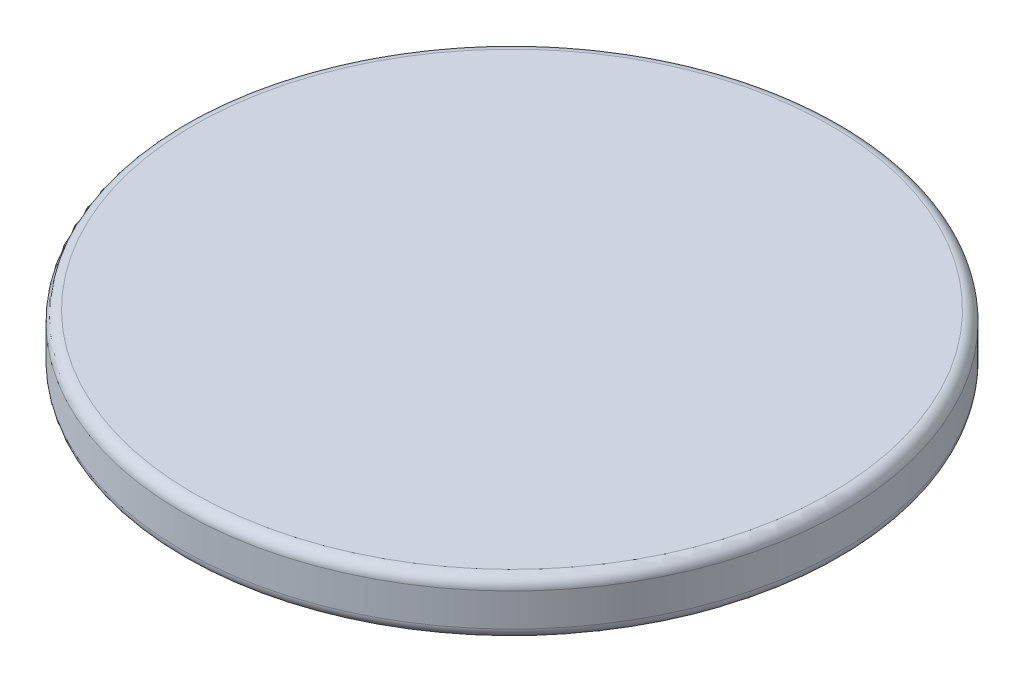
ISO-10303-21;
HEADER;
FILE_DESCRIPTION(('STEP AP214'),'2;1');
FILE_NAME('part.step','',(''),(''),'','','');
FILE_SCHEMA(('AUTOMOTIVE_DESIGN { 1 0 10303 214 1 1 1 1 }'));
ENDSEC;
DATA;
#1=APPLICATION_CONTEXT('core data for automotive mechanical design processes');
#2=APPLICATION_PROTOCOL_DEFINITION('international standard','automotive_design',2000,#1);
#3=PRODUCT_CONTEXT('',#1,'mechanical');
#4=PRODUCT('Part','Part','',(#3));
#5=PRODUCT_RELATED_PRODUCT_CATEGORY('part','',(#4));
#6=PRODUCT_DEFINITION_FORMATION('','',#4);
#7=PRODUCT_DEFINITION_CONTEXT('part definition',#1,'design');
#8=PRODUCT_DEFINITION('design','',#6,#7);
#9=PRODUCT_DEFINITION_SHAPE('','',#8);
#10=(LENGTH_UNIT() NAMED_UNIT(*) SI_UNIT(.MILLI.,.METRE.));
#11=(NAMED_UNIT(*) PLANE_ANGLE_UNIT() SI_UNIT($,.RADIAN.));
#12=(NAMED_UNIT(*) SI_UNIT($,.STERADIAN.) SOLID_ANGLE_UNIT());
#13=UNCERTAINTY_MEASURE_WITH_UNIT(LENGTH_MEASURE(1.E-05),#10,'distance_accuracy_value','');
#14=(GEOMETRIC_REPRESENTATION_CONTEXT(3) GLOBAL_UNCERTAINTY_ASSIGNED_CONTEXT((#13)) GLOBAL_UNIT_ASSIGNED_CONTEXT((#10,
#11,#12)) REPRESENTATION_CONTEXT('',''));
#15=CARTESIAN_POINT('',(0.,0.,0.));
#16=DIRECTION('',(0.,0.,1.));
#17=DIRECTION('',(1.,0.,0.));
#18=AXIS2_PLACEMENT_3D('',#15,#16,#17);
#19=CARTESIAN_POINT('',(0.,38.1,0.));
#20=DIRECTION('',(0.,-1.,0.));
#21=DIRECTION('',(0.,0.,-1.));
#22=AXIS2_PLACEMENT_3D('',#19,#20,#21);
#23=CYLINDRICAL_SURFACE('',#22,228.6);
#24=CARTESIAN_POINT('',(0.,7.62,0.));
#25=DIRECTION('',(0.,1.,0.));
#26=DIRECTION('',(0.,0.,1.));
#27=AXIS2_PLACEMENT_3D('',#24,#25,#26);
#28=CIRCLE('',#27,228.6);
#29=CARTESIAN_POINT('',(0.,7.62,-228.6));
#30=VERTEX_POINT('',#29);
#31=EDGE_CURVE('E48',#30,#30,#28,.T.);
#32=CARTESIAN_POINT('',(0.,30.48,0.));
#33=DIRECTION('',(0.,1.,0.));
#34=DIRECTION('',(0.,0.,1.));
#35=AXIS2_PLACEMENT_3D('',#32,#33,#34);
#36=CIRCLE('',#35,228.6);
#37=CARTESIAN_POINT('',(0.,30.48,-228.6));
#38=VERTEX_POINT('',#37);
#39=EDGE_CURVE('E53',#38,#38,#36,.F.);
#40=CARTESIAN_POINT('',(0.,7.62,-228.6));
#41=CARTESIAN_POINT('',(0.,7.858125,-228.6));
#42=CARTESIAN_POINT('',(0.,8.09625,-228.6));
#43=CARTESIAN_POINT('',(0.,8.5725,-228.6));
#44=CARTESIAN_POINT('',(0.,8.810625,-228.6));
#45=CARTESIAN_POINT('',(0.,9.286875,-228.6));
#46=CARTESIAN_POINT('',(0.,9.525,-228.6));
#47=CARTESIAN_POINT('',(0.,10.00125,-228.6));
#48=CARTESIAN_POINT('',(0.,10.239375,-228.6));
#49=CARTESIAN_POINT('',(0.,10.715625,-228.6));
#50=CARTESIAN_POINT('',(0.,10.95375,-228.6));
#51=CARTESIAN_POINT('',(0.,11.43,-228.6));
#52=CARTESIAN_POINT('',(0.,11.668125,-228.6));
#53=CARTESIAN_POINT('',(0.,12.144375,-228.6));
#54=CARTESIAN_POINT('',(0.,12.3825,-228.6));
#55=CARTESIAN_POINT('',(0.,12.85875,-228.6));
#56=CARTESIAN_POINT('',(0.,13.096875,-228.6));
#57=CARTESIAN_POINT('',(0.,13.573125,-228.6));
#58=CARTESIAN_POINT('',(0.,13.81125,-228.6));
#59=CARTESIAN_POINT('',(0.,14.2875,-228.6));
#60=CARTESIAN_POINT('',(0.,14.525625,-228.6));
#61=CARTESIAN_POINT('',(0.,15.001875,-228.6));
#62=CARTESIAN_POINT('',(0.,15.24,-228.6));
#63=CARTESIAN_POINT('',(0.,15.71625,-228.6));
#64=CARTESIAN_POINT('',(0.,15.954375,-228.6));
#65=CARTESIAN_POINT('',(0.,16.430625,-228.6));
#66=CARTESIAN_POINT('',(0.,16.66875,-228.6));
#67=CARTESIAN_POINT('',(0.,17.145,-228.6));
#68=CARTESIAN_POINT('',(0.,17.383125,-228.6));
#69=CARTESIAN_POINT('',(0.,17.859375,-228.6));
#70=CARTESIAN_POINT('',(0.,18.0975,-228.6));
#71=CARTESIAN_POINT('',(0.,18.57375,-228.6));
#72=CARTESIAN_POINT('',(0.,18.811875,-228.6));
#73=CARTESIAN_POINT('',(0.,19.288125,-228.6));
#74=CARTESIAN_POINT('',(0.,19.52625,-228.6));
#75=CARTESIAN_POINT('',(0.,20.0025,-228.6));
#76=CARTESIAN_POINT('',(0.,20.240625,-228.6));
#77=CARTESIAN_POINT('',(0.,20.716875,-228.6));
#78=CARTESIAN_POINT('',(0.,20.955,-228.6));
#79=CARTESIAN_POINT('',(0.,21.43125,-228.6));
#80=CARTESIAN_POINT('',(0.,21.669375,-228.6));
#81=CARTESIAN_POINT('',(0.,22.145625,-228.6));
#82=CARTESIAN_POINT('',(0.,22.38375,-228.6));
#83=CARTESIAN_POINT('',(0.,22.86,-228.6));
#84=CARTESIAN_POINT('',(0.,23.098125,-228.6));
#85=CARTESIAN_POINT('',(0.,23.574375,-228.6));
#86=CARTESIAN_POINT('',(0.,23.8125,-228.6));
#87=CARTESIAN_POINT('',(0.,24.28875,-228.6));
#88=CARTESIAN_POINT('',(0.,24.526875,-228.6));
#89=CARTESIAN_POINT('',(0.,25.003125,-228.6));
#90=CARTESIAN_POINT('',(0.,25.24125,-228.6));
#91=CARTESIAN_POINT('',(0.,25.7175,-228.6));
#92=CARTESIAN_POINT('',(0.,25.955625,-228.6));
#93=CARTESIAN_POINT('',(0.,26.431875,-228.6));
#94=CARTESIAN_POINT('',(0.,26.67,-228.6));
#95=CARTESIAN_POINT('',(0.,27.14625,-228.6));
#96=CARTESIAN_POINT('',(0.,27.384375,-228.6));
#97=CARTESIAN_POINT('',(0.,27.860625,-228.6));
#98=CARTESIAN_POINT('',(0.,28.09875,-228.6));
#99=CARTESIAN_POINT('',(0.,28.575,-228.6));
#100=CARTESIAN_POINT('',(0.,28.813125,-228.6));
#101=CARTESIAN_POINT('',(0.,29.289375,-228.6));
#102=CARTESIAN_POINT('',(0.,29.5275,-228.6));
#103=CARTESIAN_POINT('',(0.,30.00375,-228.6));
#104=CARTESIAN_POINT('',(0.,30.241875,-228.6));
#105=CARTESIAN_POINT('',(0.,30.48,-228.6));
#106=B_SPLINE_CURVE_WITH_KNOTS('',3,(#40,#41,#42,#43,#44,#45,#46,#47,#48,#49,#50,#51,#52,#53,
#54,#55,#56,#57,#58,#59,#60,#61,#62,#63,#64,#65,#66,#67,#68,#69,#70,#71,#72,#73,#74,#75,#76,#77,
#78,#79,#80,#81,#82,#83,#84,#85,#86,#87,#88,#89,#90,#91,#92,#93,#94,#95,#96,#97,#98,#99,#100,
#101,#102,#103,#104,#105),.UNSPECIFIED.,.F.,.F.,(4,2,2,2,2,2,2,2,2,2,2,2,2,2,2,2,2,2,2,2,2,2,2,
2,2,2,2,2,2,2,2,2,4),(0.,0.714375,1.42875,2.143125,2.8575,3.571875,4.28625,5.000625,5.715,
6.429375,7.14375,7.858125,8.5725,9.286875,10.00125,10.715625,11.43,12.144375,12.85875,13.573125,
14.2875,15.001875,15.71625,16.430625,17.145,17.859375,18.57375,19.288125,20.0025,20.716875,
21.43125,22.145625,22.86),.UNSPECIFIED.);
#107=EDGE_CURVE('BSEAM34',#30,#38,#106,.T.);
#108=ORIENTED_EDGE('',*,*,#31,.T.);
#109=ORIENTED_EDGE('',*,*,#39,.T.);
#110=ORIENTED_EDGE('',*,*,#107,.T.);
#111=ORIENTED_EDGE('',*,*,#107,.F.);
#112=EDGE_LOOP('',(#108,#110,#109,#111));
#113=FACE_BOUND('',#112,.T.);
#114=ADVANCED_FACE('F34',(#113),#23,.T.);
#115=CARTESIAN_POINT('',(0.,38.1,0.));
#116=DIRECTION('',(0.,1.,0.));
#117=DIRECTION('',(0.,0.,1.));
#118=AXIS2_PLACEMENT_3D('',#115,#116,#117);
#119=PLANE('',#118);
#120=CARTESIAN_POINT('',(0.,38.1,0.));
#121=DIRECTION('',(0.,1.,0.));
#122=DIRECTION('',(0.,0.,1.));
#123=AXIS2_PLACEMENT_3D('',#120,#121,#122);
#124=CIRCLE('',#123,220.98);
#125=CARTESIAN_POINT('',(0.,38.1,220.98));
#126=VERTEX_POINT('',#125);
#127=EDGE_CURVE('E10',#126,#126,#124,.T.);
#128=ORIENTED_EDGE('',*,*,#127,.T.);
#129=EDGE_LOOP('',(#128));
#130=FACE_BOUND('',#129,.T.);
#131=ADVANCED_FACE('F69',(#130),#119,.T.);
#132=CARTESIAN_POINT('',(0.,0.,0.));
#133=DIRECTION('',(0.,1.,0.));
#134=DIRECTION('',(0.,0.,1.));
#135=AXIS2_PLACEMENT_3D('',#132,#133,#134);
#136=PLANE('',#135);
#137=CARTESIAN_POINT('',(0.,0.,0.));
#138=DIRECTION('',(0.,1.,0.));
#139=DIRECTION('',(0.,0.,1.));
#140=AXIS2_PLACEMENT_3D('',#137,#138,#139);
#141=CIRCLE('',#140,220.98);
#142=CARTESIAN_POINT('',(0.,0.,220.98));
#143=VERTEX_POINT('',#142);
#144=EDGE_CURVE('E42',#143,#143,#141,.F.);
#145=ORIENTED_EDGE('',*,*,#144,.T.);
#146=EDGE_LOOP('',(#145));
#147=FACE_BOUND('',#146,.T.);
#148=ADVANCED_FACE('F66',(#147),#136,.F.);
#149=CARTESIAN_POINT('',(0.,7.62,0.));
#150=DIRECTION('',(0.,1.,0.));
#151=DIRECTION('',(0.,0.,1.));
#152=AXIS2_PLACEMENT_3D('',#149,#150,#151);
#153=TOROIDAL_SURFACE('',#152,220.98,7.62);
#154=ORIENTED_EDGE('',*,*,#144,.F.);
#155=EDGE_LOOP('',(#154));
#156=FACE_BOUND('',#155,.T.);
#157=ORIENTED_EDGE('',*,*,#31,.F.);
#158=EDGE_LOOP('',(#157));
#159=FACE_BOUND('',#158,.T.);
#160=ADVANCED_FACE('F62',(#156,#159),#153,.T.);
#161=CARTESIAN_POINT('',(0.,30.48,0.));
#162=DIRECTION('',(0.,1.,0.));
#163=DIRECTION('',(0.,0.,1.));
#164=AXIS2_PLACEMENT_3D('',#161,#162,#163);
#165=TOROIDAL_SURFACE('',#164,220.98,7.62);
#166=ORIENTED_EDGE('',*,*,#39,.F.);
#167=EDGE_LOOP('',(#166));
#168=FACE_BOUND('',#167,.T.);
#169=ORIENTED_EDGE('',*,*,#127,.F.);
#170=EDGE_LOOP('',(#169));
#171=FACE_BOUND('',#170,.T.);
#172=ADVANCED_FACE('F36',(#168,#171),#165,.T.);
#173=CLOSED_SHELL('',(#114,#131,#148,#160,#172));
#174=MANIFOLD_SOLID_BREP('B2',#173);
#175=ADVANCED_BREP_SHAPE_REPRESENTATION('',(#18,#174),#14);
#176=SHAPE_DEFINITION_REPRESENTATION(#9,#175);
ENDSEC;
END-ISO-10303-21;
